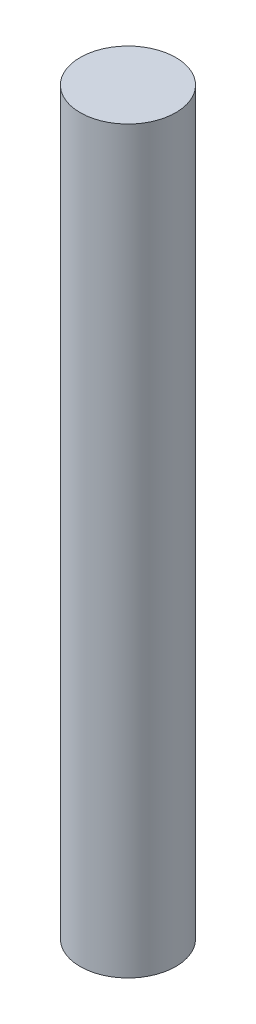
ISO-10303-21;
HEADER;
FILE_DESCRIPTION(('STEP AP214'),'2;1');
FILE_NAME('part.step','',(''),(''),'','','');
FILE_SCHEMA(('AUTOMOTIVE_DESIGN { 1 0 10303 214 1 1 1 1 }'));
ENDSEC;
DATA;
#1=APPLICATION_CONTEXT('core data for automotive mechanical design processes');
#2=APPLICATION_PROTOCOL_DEFINITION('international standard','automotive_design',2000,#1);
#3=PRODUCT_CONTEXT('',#1,'mechanical');
#4=PRODUCT('Part','Part','',(#3));
#5=PRODUCT_RELATED_PRODUCT_CATEGORY('part','',(#4));
#6=PRODUCT_DEFINITION_FORMATION('','',#4);
#7=PRODUCT_DEFINITION_CONTEXT('part definition',#1,'design');
#8=PRODUCT_DEFINITION('design','',#6,#7);
#9=PRODUCT_DEFINITION_SHAPE('','',#8);
#10=(LENGTH_UNIT() NAMED_UNIT(*) SI_UNIT(.MILLI.,.METRE.));
#11=(NAMED_UNIT(*) PLANE_ANGLE_UNIT() SI_UNIT($,.RADIAN.));
#12=(NAMED_UNIT(*) SI_UNIT($,.STERADIAN.) SOLID_ANGLE_UNIT());
#13=UNCERTAINTY_MEASURE_WITH_UNIT(LENGTH_MEASURE(1.E-05),#10,'distance_accuracy_value','');
#14=(GEOMETRIC_REPRESENTATION_CONTEXT(3) GLOBAL_UNCERTAINTY_ASSIGNED_CONTEXT((#13)) GLOBAL_UNIT_ASSIGNED_CONTEXT((#10,
#11,#12)) REPRESENTATION_CONTEXT('',''));
#15=CARTESIAN_POINT('',(0.,0.,0.));
#16=DIRECTION('',(0.,0.,1.));
#17=DIRECTION('',(1.,0.,0.));
#18=AXIS2_PLACEMENT_3D('',#15,#16,#17);
#19=CARTESIAN_POINT('',(0.,23.2,0.));
#20=DIRECTION('',(0.,-1.,0.));
#21=DIRECTION('',(0.,0.,-1.));
#22=AXIS2_PLACEMENT_3D('',#19,#20,#21);
#23=CYLINDRICAL_SURFACE('',#22,1.5);
#24=CARTESIAN_POINT('',(0.,23.2,0.));
#25=DIRECTION('',(0.,1.,0.));
#26=DIRECTION('',(0.,0.,1.));
#27=AXIS2_PLACEMENT_3D('',#24,#25,#26);
#28=CIRCLE('',#27,1.5);
#29=CARTESIAN_POINT('',(0.,23.2,1.5));
#30=VERTEX_POINT('',#29);
#31=EDGE_CURVE('E10',#30,#30,#28,.T.);
#32=ORIENTED_EDGE('',*,*,#31,.F.);
#33=EDGE_LOOP('',(#32));
#34=FACE_BOUND('',#33,.T.);
#35=CARTESIAN_POINT('',(0.,0.,0.));
#36=DIRECTION('',(0.,1.,0.));
#37=DIRECTION('',(0.,0.,1.));
#38=AXIS2_PLACEMENT_3D('',#35,#36,#37);
#39=CIRCLE('',#38,1.5);
#40=CARTESIAN_POINT('',(0.,0.,1.5));
#41=VERTEX_POINT('',#40);
#42=EDGE_CURVE('E34',#41,#41,#39,.T.);
#43=ORIENTED_EDGE('',*,*,#42,.T.);
#44=EDGE_LOOP('',(#43));
#45=FACE_BOUND('',#44,.T.);
#46=ADVANCED_FACE('F31',(#34,#45),#23,.T.);
#47=CARTESIAN_POINT('',(0.,23.2,0.));
#48=DIRECTION('',(0.,1.,0.));
#49=DIRECTION('',(0.,0.,1.));
#50=AXIS2_PLACEMENT_3D('',#47,#48,#49);
#51=PLANE('',#50);
#52=ORIENTED_EDGE('',*,*,#31,.T.);
#53=EDGE_LOOP('',(#52));
#54=FACE_BOUND('',#53,.T.);
#55=ADVANCED_FACE('F46',(#54),#51,.T.);
#56=CARTESIAN_POINT('',(0.,0.,0.));
#57=DIRECTION('',(0.,1.,0.));
#58=DIRECTION('',(0.,0.,1.));
#59=AXIS2_PLACEMENT_3D('',#56,#57,#58);
#60=PLANE('',#59);
#61=ORIENTED_EDGE('',*,*,#42,.F.);
#62=EDGE_LOOP('',(#61));
#63=FACE_BOUND('',#62,.T.);
#64=ADVANCED_FACE('F44',(#63),#60,.F.);
#65=CLOSED_SHELL('',(#46,#55,#64));
#66=MANIFOLD_SOLID_BREP('B2',#65);
#67=ADVANCED_BREP_SHAPE_REPRESENTATION('',(#18,#66),#14);
#68=SHAPE_DEFINITION_REPRESENTATION(#9,#67);
ENDSEC;
END-ISO-10303-21;
